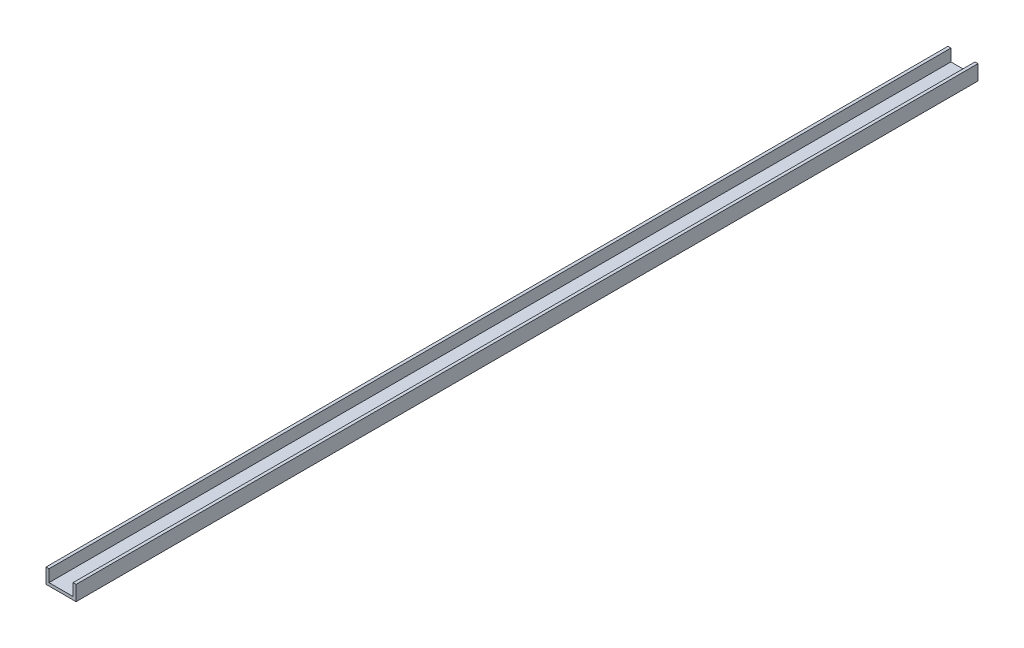
ISO-10303-21;
HEADER;
FILE_DESCRIPTION(('STEP AP214'),'2;1');
FILE_NAME('part.step','',(''),(''),'','','');
FILE_SCHEMA(('AUTOMOTIVE_DESIGN { 1 0 10303 214 1 1 1 1 }'));
ENDSEC;
DATA;
#1=APPLICATION_CONTEXT('core data for automotive mechanical design processes');
#2=APPLICATION_PROTOCOL_DEFINITION('international standard','automotive_design',2000,#1);
#3=PRODUCT_CONTEXT('',#1,'mechanical');
#4=PRODUCT('Part','Part','',(#3));
#5=PRODUCT_RELATED_PRODUCT_CATEGORY('part','',(#4));
#6=PRODUCT_DEFINITION_FORMATION('','',#4);
#7=PRODUCT_DEFINITION_CONTEXT('part definition',#1,'design');
#8=PRODUCT_DEFINITION('design','',#6,#7);
#9=PRODUCT_DEFINITION_SHAPE('','',#8);
#10=(LENGTH_UNIT() NAMED_UNIT(*) SI_UNIT(.MILLI.,.METRE.));
#11=(NAMED_UNIT(*) PLANE_ANGLE_UNIT() SI_UNIT($,.RADIAN.));
#12=(NAMED_UNIT(*) SI_UNIT($,.STERADIAN.) SOLID_ANGLE_UNIT());
#13=UNCERTAINTY_MEASURE_WITH_UNIT(LENGTH_MEASURE(1.E-05),#10,'distance_accuracy_value','');
#14=(GEOMETRIC_REPRESENTATION_CONTEXT(3) GLOBAL_UNCERTAINTY_ASSIGNED_CONTEXT((#13)) GLOBAL_UNIT_ASSIGNED_CONTEXT((#10,
#11,#12)) REPRESENTATION_CONTEXT('',''));
#15=CARTESIAN_POINT('',(0.,0.,0.));
#16=DIRECTION('',(0.,0.,1.));
#17=DIRECTION('',(1.,0.,0.));
#18=AXIS2_PLACEMENT_3D('',#15,#16,#17);
#19=CARTESIAN_POINT('',(1.,0.,300.));
#20=DIRECTION('',(0.,-1.,0.));
#21=DIRECTION('',(1.,0.,0.));
#22=AXIS2_PLACEMENT_3D('',#19,#20,#21);
#23=PLANE('',#22);
#24=DIRECTION('',(-1.,0.,0.));
#25=VECTOR('',#24,1.);
#26=CARTESIAN_POINT('',(1.,0.,0.));
#27=LINE('',#26,#25);
#28=CARTESIAN_POINT('',(1.,0.,0.));
#29=VERTEX_POINT('',#28);
#30=CARTESIAN_POINT('',(0.,0.,0.));
#31=VERTEX_POINT('',#30);
#32=EDGE_CURVE('E140',#29,#31,#27,.T.);
#33=ORIENTED_EDGE('',*,*,#32,.T.);
#34=DIRECTION('',(0.,0.,-1.));
#35=VECTOR('',#34,1.);
#36=CARTESIAN_POINT('',(0.,0.,300.));
#37=LINE('',#36,#35);
#38=CARTESIAN_POINT('',(0.,0.,300.));
#39=VERTEX_POINT('',#38);
#40=EDGE_CURVE('E11',#39,#31,#37,.T.);
#41=ORIENTED_EDGE('',*,*,#40,.F.);
#42=DIRECTION('',(-1.,0.,0.));
#43=VECTOR('',#42,1.);
#44=CARTESIAN_POINT('',(1.,0.,300.));
#45=LINE('',#44,#43);
#46=CARTESIAN_POINT('',(1.,0.,300.));
#47=VERTEX_POINT('',#46);
#48=EDGE_CURVE('E162',#47,#39,#45,.T.);
#49=ORIENTED_EDGE('',*,*,#48,.F.);
#50=DIRECTION('',(0.,0.,-1.));
#51=VECTOR('',#50,1.);
#52=CARTESIAN_POINT('',(1.,0.,300.));
#53=LINE('',#52,#51);
#54=EDGE_CURVE('E136',#47,#29,#53,.T.);
#55=ORIENTED_EDGE('',*,*,#54,.T.);
#56=EDGE_LOOP('',(#33,#41,#49,#55));
#57=FACE_BOUND('',#56,.T.);
#58=ADVANCED_FACE('F39',(#57),#23,.F.);
#59=CARTESIAN_POINT('',(0.,0.,300.));
#60=DIRECTION('',(1.,0.,0.));
#61=DIRECTION('',(0.,0.,-1.));
#62=AXIS2_PLACEMENT_3D('',#59,#60,#61);
#63=PLANE('',#62);
#64=DIRECTION('',(0.,-1.,0.));
#65=VECTOR('',#64,1.);
#66=CARTESIAN_POINT('',(0.,0.,0.));
#67=LINE('',#66,#65);
#68=CARTESIAN_POINT('',(0.,-5.,0.));
#69=VERTEX_POINT('',#68);
#70=EDGE_CURVE('E144',#31,#69,#67,.T.);
#71=ORIENTED_EDGE('',*,*,#70,.T.);
#72=DIRECTION('',(0.,0.,-1.));
#73=VECTOR('',#72,1.);
#74=CARTESIAN_POINT('',(0.,-5.,300.));
#75=LINE('',#74,#73);
#76=CARTESIAN_POINT('',(0.,-5.,300.));
#77=VERTEX_POINT('',#76);
#78=EDGE_CURVE('E48',#77,#69,#75,.T.);
#79=ORIENTED_EDGE('',*,*,#78,.F.);
#80=DIRECTION('',(0.,-1.,0.));
#81=VECTOR('',#80,1.);
#82=CARTESIAN_POINT('',(0.,0.,300.));
#83=LINE('',#82,#81);
#84=EDGE_CURVE('E99',#39,#77,#83,.T.);
#85=ORIENTED_EDGE('',*,*,#84,.F.);
#86=ORIENTED_EDGE('',*,*,#40,.T.);
#87=EDGE_LOOP('',(#71,#79,#85,#86));
#88=FACE_BOUND('',#87,.T.);
#89=ADVANCED_FACE('F208',(#88),#63,.F.);
#90=CARTESIAN_POINT('',(0.,-5.,300.));
#91=DIRECTION('',(0.,1.,0.));
#92=DIRECTION('',(0.,0.,1.));
#93=AXIS2_PLACEMENT_3D('',#90,#91,#92);
#94=PLANE('',#93);
#95=DIRECTION('',(1.,0.,0.));
#96=VECTOR('',#95,1.);
#97=CARTESIAN_POINT('',(0.,-5.,0.));
#98=LINE('',#97,#96);
#99=CARTESIAN_POINT('',(10.,-5.,0.));
#100=VERTEX_POINT('',#99);
#101=EDGE_CURVE('E147',#69,#100,#98,.T.);
#102=ORIENTED_EDGE('',*,*,#101,.T.);
#103=DIRECTION('',(0.,0.,-1.));
#104=VECTOR('',#103,1.);
#105=CARTESIAN_POINT('',(10.,-5.,300.));
#106=LINE('',#105,#104);
#107=CARTESIAN_POINT('',(10.,-5.,300.));
#108=VERTEX_POINT('',#107);
#109=EDGE_CURVE('E173',#108,#100,#106,.T.);
#110=ORIENTED_EDGE('',*,*,#109,.F.);
#111=DIRECTION('',(1.,0.,0.));
#112=VECTOR('',#111,1.);
#113=CARTESIAN_POINT('',(0.,-5.,300.));
#114=LINE('',#113,#112);
#115=EDGE_CURVE('E183',#77,#108,#114,.T.);
#116=ORIENTED_EDGE('',*,*,#115,.F.);
#117=ORIENTED_EDGE('',*,*,#78,.T.);
#118=EDGE_LOOP('',(#102,#110,#116,#117));
#119=FACE_BOUND('',#118,.T.);
#120=ADVANCED_FACE('F181',(#119),#94,.F.);
#121=CARTESIAN_POINT('',(10.,-5.,300.));
#122=DIRECTION('',(-1.,0.,0.));
#123=DIRECTION('',(0.,0.,1.));
#124=AXIS2_PLACEMENT_3D('',#121,#122,#123);
#125=PLANE('',#124);
#126=DIRECTION('',(0.,1.,0.));
#127=VECTOR('',#126,1.);
#128=CARTESIAN_POINT('',(10.,-5.,0.));
#129=LINE('',#128,#127);
#130=CARTESIAN_POINT('',(10.,0.,0.));
#131=VERTEX_POINT('',#130);
#132=EDGE_CURVE('E150',#100,#131,#129,.T.);
#133=ORIENTED_EDGE('',*,*,#132,.T.);
#134=DIRECTION('',(0.,0.,-1.));
#135=VECTOR('',#134,1.);
#136=CARTESIAN_POINT('',(10.,0.,300.));
#137=LINE('',#136,#135);
#138=CARTESIAN_POINT('',(10.,0.,300.));
#139=VERTEX_POINT('',#138);
#140=EDGE_CURVE('E169',#139,#131,#137,.T.);
#141=ORIENTED_EDGE('',*,*,#140,.F.);
#142=DIRECTION('',(0.,1.,0.));
#143=VECTOR('',#142,1.);
#144=CARTESIAN_POINT('',(10.,-5.,300.));
#145=LINE('',#144,#143);
#146=EDGE_CURVE('E196',#108,#139,#145,.T.);
#147=ORIENTED_EDGE('',*,*,#146,.F.);
#148=ORIENTED_EDGE('',*,*,#109,.T.);
#149=EDGE_LOOP('',(#133,#141,#147,#148));
#150=FACE_BOUND('',#149,.T.);
#151=ADVANCED_FACE('F191',(#150),#125,.F.);
#152=CARTESIAN_POINT('',(10.,0.,300.));
#153=DIRECTION('',(0.,-1.,0.));
#154=DIRECTION('',(1.,0.,0.));
#155=AXIS2_PLACEMENT_3D('',#152,#153,#154);
#156=PLANE('',#155);
#157=DIRECTION('',(-1.,0.,0.));
#158=VECTOR('',#157,1.);
#159=CARTESIAN_POINT('',(10.,0.,0.));
#160=LINE('',#159,#158);
#161=CARTESIAN_POINT('',(9.,0.,0.));
#162=VERTEX_POINT('',#161);
#163=EDGE_CURVE('E153',#131,#162,#160,.T.);
#164=ORIENTED_EDGE('',*,*,#163,.T.);
#165=DIRECTION('',(0.,0.,-1.));
#166=VECTOR('',#165,1.);
#167=CARTESIAN_POINT('',(9.,0.,300.));
#168=LINE('',#167,#166);
#169=CARTESIAN_POINT('',(9.,0.,300.));
#170=VERTEX_POINT('',#169);
#171=EDGE_CURVE('E129',#170,#162,#168,.T.);
#172=ORIENTED_EDGE('',*,*,#171,.F.);
#173=DIRECTION('',(-1.,0.,0.));
#174=VECTOR('',#173,1.);
#175=CARTESIAN_POINT('',(10.,0.,300.));
#176=LINE('',#175,#174);
#177=EDGE_CURVE('E118',#139,#170,#176,.T.);
#178=ORIENTED_EDGE('',*,*,#177,.F.);
#179=ORIENTED_EDGE('',*,*,#140,.T.);
#180=EDGE_LOOP('',(#164,#172,#178,#179));
#181=FACE_BOUND('',#180,.T.);
#182=ADVANCED_FACE('F194',(#181),#156,.F.);
#183=CARTESIAN_POINT('',(9.,0.,300.));
#184=DIRECTION('',(1.,0.,0.));
#185=DIRECTION('',(0.,1.,0.));
#186=AXIS2_PLACEMENT_3D('',#183,#184,#185);
#187=PLANE('',#186);
#188=DIRECTION('',(0.,-1.,0.));
#189=VECTOR('',#188,1.);
#190=CARTESIAN_POINT('',(9.,0.,0.));
#191=LINE('',#190,#189);
#192=CARTESIAN_POINT('',(9.,-4.,0.));
#193=VERTEX_POINT('',#192);
#194=EDGE_CURVE('E127',#162,#193,#191,.T.);
#195=ORIENTED_EDGE('',*,*,#194,.T.);
#196=DIRECTION('',(0.,0.,-1.));
#197=VECTOR('',#196,1.);
#198=CARTESIAN_POINT('',(9.,-4.,300.));
#199=LINE('',#198,#197);
#200=CARTESIAN_POINT('',(9.,-4.,300.));
#201=VERTEX_POINT('',#200);
#202=EDGE_CURVE('E124',#201,#193,#199,.T.);
#203=ORIENTED_EDGE('',*,*,#202,.F.);
#204=DIRECTION('',(0.,-1.,0.));
#205=VECTOR('',#204,1.);
#206=CARTESIAN_POINT('',(9.,0.,300.));
#207=LINE('',#206,#205);
#208=EDGE_CURVE('E112',#170,#201,#207,.T.);
#209=ORIENTED_EDGE('',*,*,#208,.F.);
#210=ORIENTED_EDGE('',*,*,#171,.T.);
#211=EDGE_LOOP('',(#195,#203,#209,#210));
#212=FACE_BOUND('',#211,.T.);
#213=ADVANCED_FACE('F125',(#212),#187,.F.);
#214=CARTESIAN_POINT('',(9.,-4.,300.));
#215=DIRECTION('',(0.,-1.,0.));
#216=DIRECTION('',(1.,0.,0.));
#217=AXIS2_PLACEMENT_3D('',#214,#215,#216);
#218=PLANE('',#217);
#219=DIRECTION('',(-1.,0.,0.));
#220=VECTOR('',#219,1.);
#221=CARTESIAN_POINT('',(9.,-4.,0.));
#222=LINE('',#221,#220);
#223=CARTESIAN_POINT('',(1.,-4.,0.));
#224=VERTEX_POINT('',#223);
#225=EDGE_CURVE('E85',#193,#224,#222,.T.);
#226=ORIENTED_EDGE('',*,*,#225,.T.);
#227=DIRECTION('',(0.,0.,-1.));
#228=VECTOR('',#227,1.);
#229=CARTESIAN_POINT('',(1.,-4.,300.));
#230=LINE('',#229,#228);
#231=CARTESIAN_POINT('',(1.,-4.,300.));
#232=VERTEX_POINT('',#231);
#233=EDGE_CURVE('E130',#232,#224,#230,.T.);
#234=ORIENTED_EDGE('',*,*,#233,.F.);
#235=DIRECTION('',(-1.,0.,0.));
#236=VECTOR('',#235,1.);
#237=CARTESIAN_POINT('',(9.,-4.,300.));
#238=LINE('',#237,#236);
#239=EDGE_CURVE('E116',#201,#232,#238,.T.);
#240=ORIENTED_EDGE('',*,*,#239,.F.);
#241=ORIENTED_EDGE('',*,*,#202,.T.);
#242=EDGE_LOOP('',(#226,#234,#240,#241));
#243=FACE_BOUND('',#242,.T.);
#244=ADVANCED_FACE('F132',(#243),#218,.F.);
#245=CARTESIAN_POINT('',(1.,-4.,300.));
#246=DIRECTION('',(-1.,0.,0.));
#247=DIRECTION('',(0.,0.,1.));
#248=AXIS2_PLACEMENT_3D('',#245,#246,#247);
#249=PLANE('',#248);
#250=DIRECTION('',(0.,1.,0.));
#251=VECTOR('',#250,1.);
#252=CARTESIAN_POINT('',(1.,-4.,0.));
#253=LINE('',#252,#251);
#254=EDGE_CURVE('E91',#224,#29,#253,.T.);
#255=ORIENTED_EDGE('',*,*,#254,.T.);
#256=ORIENTED_EDGE('',*,*,#54,.F.);
#257=DIRECTION('',(0.,1.,0.));
#258=VECTOR('',#257,1.);
#259=CARTESIAN_POINT('',(1.,-4.,300.));
#260=LINE('',#259,#258);
#261=EDGE_CURVE('E56',#232,#47,#260,.T.);
#262=ORIENTED_EDGE('',*,*,#261,.F.);
#263=ORIENTED_EDGE('',*,*,#233,.T.);
#264=EDGE_LOOP('',(#255,#256,#262,#263));
#265=FACE_BOUND('',#264,.T.);
#266=ADVANCED_FACE('F224',(#265),#249,.F.);
#267=CARTESIAN_POINT('',(0.,0.,300.));
#268=DIRECTION('',(0.,0.,1.));
#269=DIRECTION('',(1.,0.,0.));
#270=AXIS2_PLACEMENT_3D('',#267,#268,#269);
#271=PLANE('',#270);
#272=ORIENTED_EDGE('',*,*,#48,.T.);
#273=ORIENTED_EDGE('',*,*,#84,.T.);
#274=ORIENTED_EDGE('',*,*,#115,.T.);
#275=ORIENTED_EDGE('',*,*,#146,.T.);
#276=ORIENTED_EDGE('',*,*,#177,.T.);
#277=ORIENTED_EDGE('',*,*,#208,.T.);
#278=ORIENTED_EDGE('',*,*,#239,.T.);
#279=ORIENTED_EDGE('',*,*,#261,.T.);
#280=EDGE_LOOP('',(#272,#273,#274,#275,#276,#277,#278,#279));
#281=FACE_BOUND('',#280,.T.);
#282=ADVANCED_FACE('F114',(#281),#271,.T.);
#283=CARTESIAN_POINT('',(0.,0.,0.));
#284=DIRECTION('',(0.,0.,1.));
#285=DIRECTION('',(1.,0.,0.));
#286=AXIS2_PLACEMENT_3D('',#283,#284,#285);
#287=PLANE('',#286);
#288=ORIENTED_EDGE('',*,*,#32,.F.);
#289=ORIENTED_EDGE('',*,*,#254,.F.);
#290=ORIENTED_EDGE('',*,*,#225,.F.);
#291=ORIENTED_EDGE('',*,*,#194,.F.);
#292=ORIENTED_EDGE('',*,*,#163,.F.);
#293=ORIENTED_EDGE('',*,*,#132,.F.);
#294=ORIENTED_EDGE('',*,*,#101,.F.);
#295=ORIENTED_EDGE('',*,*,#70,.F.);
#296=EDGE_LOOP('',(#288,#289,#290,#291,#292,#293,#294,#295));
#297=FACE_BOUND('',#296,.T.);
#298=ADVANCED_FACE('F187',(#297),#287,.F.);
#299=CLOSED_SHELL('',(#58,#89,#120,#151,#182,#213,#244,#266,#282,#298));
#300=MANIFOLD_SOLID_BREP('B2',#299);
#301=ADVANCED_BREP_SHAPE_REPRESENTATION('',(#18,#300),#14);
#302=SHAPE_DEFINITION_REPRESENTATION(#9,#301);
ENDSEC;
END-ISO-10303-21;
